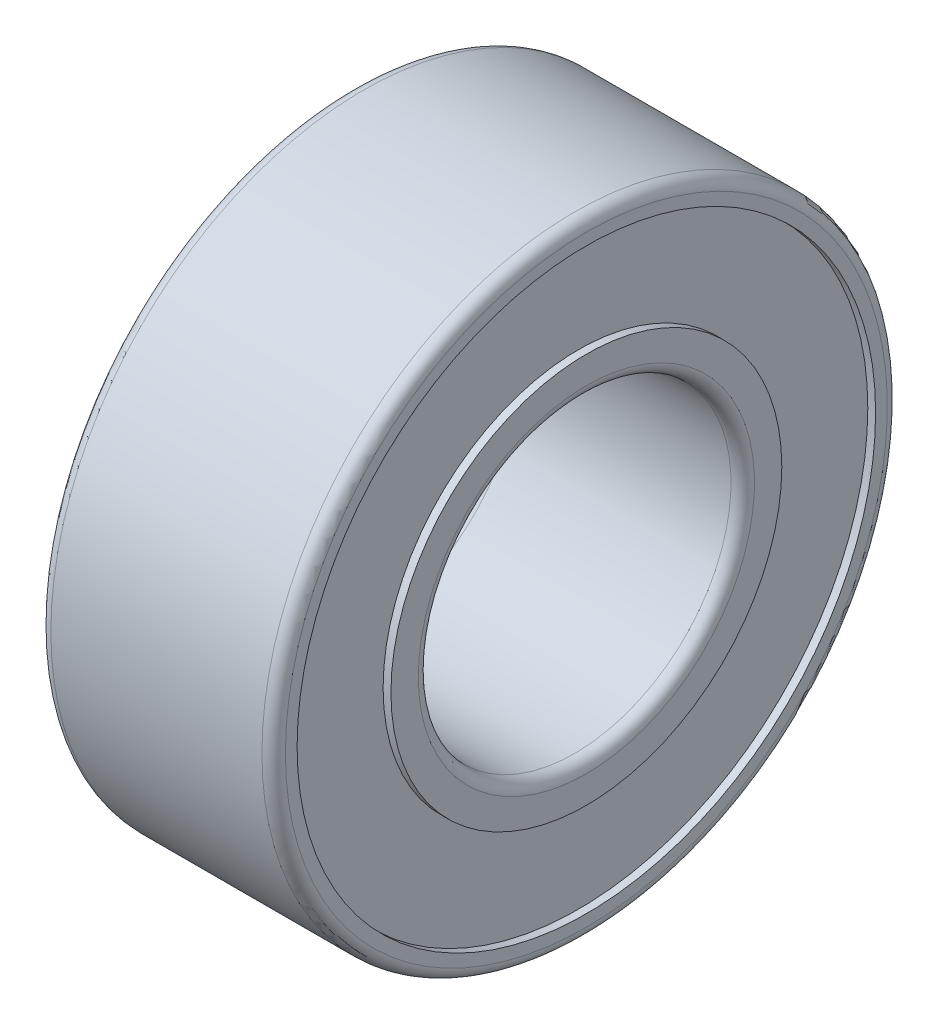
ISO-10303-21;
HEADER;
FILE_DESCRIPTION(('STEP AP214'),'2;1');
FILE_NAME('part.step','',(''),(''),'','','');
FILE_SCHEMA(('AUTOMOTIVE_DESIGN { 1 0 10303 214 1 1 1 1 }'));
ENDSEC;
DATA;
#1=APPLICATION_CONTEXT('core data for automotive mechanical design processes');
#2=APPLICATION_PROTOCOL_DEFINITION('international standard','automotive_design',2000,#1);
#3=PRODUCT_CONTEXT('',#1,'mechanical');
#4=PRODUCT('Part','Part','',(#3));
#5=PRODUCT_RELATED_PRODUCT_CATEGORY('part','',(#4));
#6=PRODUCT_DEFINITION_FORMATION('','',#4);
#7=PRODUCT_DEFINITION_CONTEXT('part definition',#1,'design');
#8=PRODUCT_DEFINITION('design','',#6,#7);
#9=PRODUCT_DEFINITION_SHAPE('','',#8);
#10=(LENGTH_UNIT() NAMED_UNIT(*) SI_UNIT(.MILLI.,.METRE.));
#11=(NAMED_UNIT(*) PLANE_ANGLE_UNIT() SI_UNIT($,.RADIAN.));
#12=(NAMED_UNIT(*) SI_UNIT($,.STERADIAN.) SOLID_ANGLE_UNIT());
#13=UNCERTAINTY_MEASURE_WITH_UNIT(LENGTH_MEASURE(1.E-05),#10,'distance_accuracy_value','');
#14=(GEOMETRIC_REPRESENTATION_CONTEXT(3) GLOBAL_UNCERTAINTY_ASSIGNED_CONTEXT((#13)) GLOBAL_UNIT_ASSIGNED_CONTEXT((#10,
#11,#12)) REPRESENTATION_CONTEXT('',''));
#15=CARTESIAN_POINT('',(0.,0.,0.));
#16=DIRECTION('',(0.,0.,1.));
#17=DIRECTION('',(1.,0.,0.));
#18=AXIS2_PLACEMENT_3D('',#15,#16,#17);
#19=CARTESIAN_POINT('',(-1.35,0.,0.));
#20=DIRECTION('',(1.,0.,0.));
#21=DIRECTION('',(0.,0.,1.));
#22=AXIS2_PLACEMENT_3D('',#19,#20,#21);
#23=TOROIDAL_SURFACE('',#22,2.15,0.15);
#24=CARTESIAN_POINT('',(-1.5,0.,0.));
#25=DIRECTION('',(-1.,0.,0.));
#26=DIRECTION('',(0.,0.,1.));
#27=AXIS2_PLACEMENT_3D('',#24,#25,#26);
#28=CIRCLE('',#27,2.15);
#29=CARTESIAN_POINT('',(-1.5,0.,2.15));
#30=VERTEX_POINT('',#29);
#31=EDGE_CURVE('E43',#30,#30,#28,.T.);
#32=ORIENTED_EDGE('',*,*,#31,.T.);
#33=EDGE_LOOP('',(#32));
#34=FACE_BOUND('',#33,.T.);
#35=CARTESIAN_POINT('',(-1.35,0.,0.));
#36=DIRECTION('',(1.,0.,0.));
#37=DIRECTION('',(0.,0.,1.));
#38=AXIS2_PLACEMENT_3D('',#35,#36,#37);
#39=CIRCLE('',#38,2.);
#40=CARTESIAN_POINT('',(-1.35,0.,2.));
#41=VERTEX_POINT('',#40);
#42=EDGE_CURVE('E79',#41,#41,#39,.T.);
#43=ORIENTED_EDGE('',*,*,#42,.T.);
#44=EDGE_LOOP('',(#43));
#45=FACE_BOUND('',#44,.T.);
#46=ADVANCED_FACE('F15',(#34,#45),#23,.T.);
#47=CARTESIAN_POINT('',(-1.35,0.,0.));
#48=DIRECTION('',(1.,0.,0.));
#49=DIRECTION('',(0.,0.,1.));
#50=AXIS2_PLACEMENT_3D('',#47,#48,#49);
#51=TOROIDAL_SURFACE('',#50,3.85,0.15);
#52=CARTESIAN_POINT('',(-1.35,0.,0.));
#53=DIRECTION('',(-1.,0.,0.));
#54=DIRECTION('',(0.,0.,1.));
#55=AXIS2_PLACEMENT_3D('',#52,#53,#54);
#56=CIRCLE('',#55,4.);
#57=CARTESIAN_POINT('',(-1.35,0.,4.));
#58=VERTEX_POINT('',#57);
#59=EDGE_CURVE('E47',#58,#58,#56,.T.);
#60=ORIENTED_EDGE('',*,*,#59,.T.);
#61=EDGE_LOOP('',(#60));
#62=FACE_BOUND('',#61,.T.);
#63=CARTESIAN_POINT('',(-1.5,0.,0.));
#64=DIRECTION('',(1.,0.,0.));
#65=DIRECTION('',(0.,0.,1.));
#66=AXIS2_PLACEMENT_3D('',#63,#64,#65);
#67=CIRCLE('',#66,3.85);
#68=CARTESIAN_POINT('',(-1.5,0.,3.85));
#69=VERTEX_POINT('',#68);
#70=EDGE_CURVE('E10',#69,#69,#67,.T.);
#71=ORIENTED_EDGE('',*,*,#70,.T.);
#72=EDGE_LOOP('',(#71));
#73=FACE_BOUND('',#72,.T.);
#74=ADVANCED_FACE('F17',(#62,#73),#51,.T.);
#75=CARTESIAN_POINT('',(-1.5,0.,3.85));
#76=DIRECTION('',(1.,0.,0.));
#77=DIRECTION('',(0.,1.,0.));
#78=AXIS2_PLACEMENT_3D('',#75,#76,#77);
#79=PLANE('',#78);
#80=CARTESIAN_POINT('',(-1.5,0.,0.));
#81=DIRECTION('',(-1.,0.,0.));
#82=DIRECTION('',(0.,0.,1.));
#83=AXIS2_PLACEMENT_3D('',#80,#81,#82);
#84=CIRCLE('',#83,3.7);
#85=CARTESIAN_POINT('',(-1.5,0.,3.7));
#86=VERTEX_POINT('',#85);
#87=EDGE_CURVE('E23',#86,#86,#84,.T.);
#88=ORIENTED_EDGE('',*,*,#87,.F.);
#89=EDGE_LOOP('',(#88));
#90=FACE_BOUND('',#89,.T.);
#91=ORIENTED_EDGE('',*,*,#70,.F.);
#92=EDGE_LOOP('',(#91));
#93=FACE_BOUND('',#92,.T.);
#94=ADVANCED_FACE('F118',(#90,#93),#79,.F.);
#95=CARTESIAN_POINT('',(-0.75,0.,0.));
#96=DIRECTION('',(1.,0.,0.));
#97=DIRECTION('',(0.,0.,1.));
#98=AXIS2_PLACEMENT_3D('',#95,#96,#97);
#99=CYLINDRICAL_SURFACE('',#98,3.7);
#100=CARTESIAN_POINT('',(-1.4,0.,0.));
#101=DIRECTION('',(-1.,0.,0.));
#102=DIRECTION('',(0.,0.,1.));
#103=AXIS2_PLACEMENT_3D('',#100,#101,#102);
#104=CIRCLE('',#103,3.7);
#105=CARTESIAN_POINT('',(-1.4,0.,3.7));
#106=VERTEX_POINT('',#105);
#107=EDGE_CURVE('E30',#106,#106,#104,.T.);
#108=ORIENTED_EDGE('',*,*,#107,.F.);
#109=EDGE_LOOP('',(#108));
#110=FACE_BOUND('',#109,.T.);
#111=ORIENTED_EDGE('',*,*,#87,.T.);
#112=EDGE_LOOP('',(#111));
#113=FACE_BOUND('',#112,.T.);
#114=ADVANCED_FACE('F124',(#110,#113),#99,.F.);
#115=CARTESIAN_POINT('',(-1.4,0.,3.1));
#116=DIRECTION('',(1.,0.,0.));
#117=DIRECTION('',(0.,1.,0.));
#118=AXIS2_PLACEMENT_3D('',#115,#116,#117);
#119=PLANE('',#118);
#120=CARTESIAN_POINT('',(-1.4,0.,0.));
#121=DIRECTION('',(-1.,0.,0.));
#122=DIRECTION('',(0.,0.,1.));
#123=AXIS2_PLACEMENT_3D('',#120,#121,#122);
#124=CIRCLE('',#123,2.5);
#125=CARTESIAN_POINT('',(-1.4,0.,2.5));
#126=VERTEX_POINT('',#125);
#127=EDGE_CURVE('E36',#126,#126,#124,.T.);
#128=ORIENTED_EDGE('',*,*,#127,.F.);
#129=EDGE_LOOP('',(#128));
#130=FACE_BOUND('',#129,.T.);
#131=ORIENTED_EDGE('',*,*,#107,.T.);
#132=EDGE_LOOP('',(#131));
#133=FACE_BOUND('',#132,.T.);
#134=ADVANCED_FACE('F127',(#130,#133),#119,.F.);
#135=CARTESIAN_POINT('',(-0.75,0.,0.));
#136=DIRECTION('',(1.,0.,0.));
#137=DIRECTION('',(0.,0.,1.));
#138=AXIS2_PLACEMENT_3D('',#135,#136,#137);
#139=CYLINDRICAL_SURFACE('',#138,2.5);
#140=CARTESIAN_POINT('',(-1.5,0.,0.));
#141=DIRECTION('',(-1.,0.,0.));
#142=DIRECTION('',(0.,0.,1.));
#143=AXIS2_PLACEMENT_3D('',#140,#141,#142);
#144=CIRCLE('',#143,2.5);
#145=CARTESIAN_POINT('',(-1.5,0.,2.5));
#146=VERTEX_POINT('',#145);
#147=EDGE_CURVE('E39',#146,#146,#144,.T.);
#148=ORIENTED_EDGE('',*,*,#147,.F.);
#149=EDGE_LOOP('',(#148));
#150=FACE_BOUND('',#149,.T.);
#151=ORIENTED_EDGE('',*,*,#127,.T.);
#152=EDGE_LOOP('',(#151));
#153=FACE_BOUND('',#152,.T.);
#154=ADVANCED_FACE('F143',(#150,#153),#139,.T.);
#155=CARTESIAN_POINT('',(-1.5,0.,2.25));
#156=DIRECTION('',(1.,0.,0.));
#157=DIRECTION('',(0.,1.,0.));
#158=AXIS2_PLACEMENT_3D('',#155,#156,#157);
#159=PLANE('',#158);
#160=ORIENTED_EDGE('',*,*,#147,.T.);
#161=EDGE_LOOP('',(#160));
#162=FACE_BOUND('',#161,.T.);
#163=ORIENTED_EDGE('',*,*,#31,.F.);
#164=EDGE_LOOP('',(#163));
#165=FACE_BOUND('',#164,.T.);
#166=ADVANCED_FACE('F107',(#162,#165),#159,.F.);
#167=CARTESIAN_POINT('',(1.35,0.,0.));
#168=DIRECTION('',(-1.,0.,0.));
#169=DIRECTION('',(0.,0.,1.));
#170=AXIS2_PLACEMENT_3D('',#167,#168,#169);
#171=TOROIDAL_SURFACE('',#170,2.15,0.15);
#172=CARTESIAN_POINT('',(1.5,0.,0.));
#173=DIRECTION('',(-1.,0.,0.));
#174=DIRECTION('',(0.,0.,1.));
#175=AXIS2_PLACEMENT_3D('',#172,#173,#174);
#176=CIRCLE('',#175,2.15);
#177=CARTESIAN_POINT('',(1.5,0.,2.15));
#178=VERTEX_POINT('',#177);
#179=EDGE_CURVE('E75',#178,#178,#176,.T.);
#180=ORIENTED_EDGE('',*,*,#179,.F.);
#181=EDGE_LOOP('',(#180));
#182=FACE_BOUND('',#181,.T.);
#183=CARTESIAN_POINT('',(1.35,0.,0.));
#184=DIRECTION('',(1.,0.,0.));
#185=DIRECTION('',(0.,0.,1.));
#186=AXIS2_PLACEMENT_3D('',#183,#184,#185);
#187=CIRCLE('',#186,2.);
#188=CARTESIAN_POINT('',(1.35,0.,2.));
#189=VERTEX_POINT('',#188);
#190=EDGE_CURVE('E83',#189,#189,#187,.T.);
#191=ORIENTED_EDGE('',*,*,#190,.F.);
#192=EDGE_LOOP('',(#191));
#193=FACE_BOUND('',#192,.T.);
#194=ADVANCED_FACE('F97',(#182,#193),#171,.T.);
#195=CARTESIAN_POINT('',(1.35,0.,0.));
#196=DIRECTION('',(-1.,0.,0.));
#197=DIRECTION('',(0.,0.,1.));
#198=AXIS2_PLACEMENT_3D('',#195,#196,#197);
#199=TOROIDAL_SURFACE('',#198,3.85,0.15);
#200=CARTESIAN_POINT('',(1.35,0.,0.));
#201=DIRECTION('',(-1.,0.,0.));
#202=DIRECTION('',(0.,0.,1.));
#203=AXIS2_PLACEMENT_3D('',#200,#201,#202);
#204=CIRCLE('',#203,4.);
#205=CARTESIAN_POINT('',(1.35,0.,4.));
#206=VERTEX_POINT('',#205);
#207=EDGE_CURVE('E51',#206,#206,#204,.T.);
#208=ORIENTED_EDGE('',*,*,#207,.F.);
#209=EDGE_LOOP('',(#208));
#210=FACE_BOUND('',#209,.T.);
#211=CARTESIAN_POINT('',(1.5,0.,0.));
#212=DIRECTION('',(1.,0.,0.));
#213=DIRECTION('',(0.,0.,1.));
#214=AXIS2_PLACEMENT_3D('',#211,#212,#213);
#215=CIRCLE('',#214,3.85);
#216=CARTESIAN_POINT('',(1.5,0.,3.85));
#217=VERTEX_POINT('',#216);
#218=EDGE_CURVE('E55',#217,#217,#215,.T.);
#219=ORIENTED_EDGE('',*,*,#218,.F.);
#220=EDGE_LOOP('',(#219));
#221=FACE_BOUND('',#220,.T.);
#222=ADVANCED_FACE('F94',(#210,#221),#199,.T.);
#223=CARTESIAN_POINT('',(0.75,0.,0.));
#224=DIRECTION('',(-1.,0.,0.));
#225=DIRECTION('',(0.,0.,1.));
#226=AXIS2_PLACEMENT_3D('',#223,#224,#225);
#227=CYLINDRICAL_SURFACE('',#226,4.);
#228=ORIENTED_EDGE('',*,*,#59,.F.);
#229=EDGE_LOOP('',(#228));
#230=FACE_BOUND('',#229,.T.);
#231=ORIENTED_EDGE('',*,*,#207,.T.);
#232=EDGE_LOOP('',(#231));
#233=FACE_BOUND('',#232,.T.);
#234=ADVANCED_FACE('F96',(#230,#233),#227,.T.);
#235=CARTESIAN_POINT('',(1.5,0.,3.85));
#236=DIRECTION('',(-1.,0.,0.));
#237=DIRECTION('',(0.,0.,1.));
#238=AXIS2_PLACEMENT_3D('',#235,#236,#237);
#239=PLANE('',#238);
#240=CARTESIAN_POINT('',(1.5,0.,0.));
#241=DIRECTION('',(-1.,0.,0.));
#242=DIRECTION('',(0.,0.,1.));
#243=AXIS2_PLACEMENT_3D('',#240,#241,#242);
#244=CIRCLE('',#243,3.7);
#245=CARTESIAN_POINT('',(1.5,0.,3.7));
#246=VERTEX_POINT('',#245);
#247=EDGE_CURVE('E60',#246,#246,#244,.T.);
#248=ORIENTED_EDGE('',*,*,#247,.T.);
#249=EDGE_LOOP('',(#248));
#250=FACE_BOUND('',#249,.T.);
#251=ORIENTED_EDGE('',*,*,#218,.T.);
#252=EDGE_LOOP('',(#251));
#253=FACE_BOUND('',#252,.T.);
#254=ADVANCED_FACE('F92',(#250,#253),#239,.F.);
#255=CARTESIAN_POINT('',(0.75,0.,0.));
#256=DIRECTION('',(-1.,0.,0.));
#257=DIRECTION('',(0.,0.,1.));
#258=AXIS2_PLACEMENT_3D('',#255,#256,#257);
#259=CYLINDRICAL_SURFACE('',#258,3.7);
#260=CARTESIAN_POINT('',(1.4,0.,0.));
#261=DIRECTION('',(-1.,0.,0.));
#262=DIRECTION('',(0.,0.,1.));
#263=AXIS2_PLACEMENT_3D('',#260,#261,#262);
#264=CIRCLE('',#263,3.7);
#265=CARTESIAN_POINT('',(1.4,0.,3.7));
#266=VERTEX_POINT('',#265);
#267=EDGE_CURVE('E56',#266,#266,#264,.T.);
#268=ORIENTED_EDGE('',*,*,#267,.T.);
#269=EDGE_LOOP('',(#268));
#270=FACE_BOUND('',#269,.T.);
#271=ORIENTED_EDGE('',*,*,#247,.F.);
#272=EDGE_LOOP('',(#271));
#273=FACE_BOUND('',#272,.T.);
#274=ADVANCED_FACE('F137',(#270,#273),#259,.F.);
#275=CARTESIAN_POINT('',(1.4,0.,3.1));
#276=DIRECTION('',(-1.,0.,0.));
#277=DIRECTION('',(0.,0.,1.));
#278=AXIS2_PLACEMENT_3D('',#275,#276,#277);
#279=PLANE('',#278);
#280=CARTESIAN_POINT('',(1.4,0.,0.));
#281=DIRECTION('',(-1.,0.,0.));
#282=DIRECTION('',(0.,0.,1.));
#283=AXIS2_PLACEMENT_3D('',#280,#281,#282);
#284=CIRCLE('',#283,2.5);
#285=CARTESIAN_POINT('',(1.4,0.,2.5));
#286=VERTEX_POINT('',#285);
#287=EDGE_CURVE('E61',#286,#286,#284,.T.);
#288=ORIENTED_EDGE('',*,*,#287,.T.);
#289=EDGE_LOOP('',(#288));
#290=FACE_BOUND('',#289,.T.);
#291=ORIENTED_EDGE('',*,*,#267,.F.);
#292=EDGE_LOOP('',(#291));
#293=FACE_BOUND('',#292,.T.);
#294=ADVANCED_FACE('F134',(#290,#293),#279,.F.);
#295=CARTESIAN_POINT('',(0.75,0.,0.));
#296=DIRECTION('',(-1.,0.,0.));
#297=DIRECTION('',(0.,0.,1.));
#298=AXIS2_PLACEMENT_3D('',#295,#296,#297);
#299=CYLINDRICAL_SURFACE('',#298,2.5);
#300=CARTESIAN_POINT('',(1.5,0.,0.));
#301=DIRECTION('',(-1.,0.,0.));
#302=DIRECTION('',(0.,0.,1.));
#303=AXIS2_PLACEMENT_3D('',#300,#301,#302);
#304=CIRCLE('',#303,2.5);
#305=CARTESIAN_POINT('',(1.5,0.,2.5));
#306=VERTEX_POINT('',#305);
#307=EDGE_CURVE('E65',#306,#306,#304,.T.);
#308=ORIENTED_EDGE('',*,*,#307,.T.);
#309=EDGE_LOOP('',(#308));
#310=FACE_BOUND('',#309,.T.);
#311=ORIENTED_EDGE('',*,*,#287,.F.);
#312=EDGE_LOOP('',(#311));
#313=FACE_BOUND('',#312,.T.);
#314=ADVANCED_FACE('F132',(#310,#313),#299,.T.);
#315=CARTESIAN_POINT('',(1.5,0.,2.25));
#316=DIRECTION('',(-1.,0.,0.));
#317=DIRECTION('',(0.,0.,1.));
#318=AXIS2_PLACEMENT_3D('',#315,#316,#317);
#319=PLANE('',#318);
#320=ORIENTED_EDGE('',*,*,#307,.F.);
#321=EDGE_LOOP('',(#320));
#322=FACE_BOUND('',#321,.T.);
#323=ORIENTED_EDGE('',*,*,#179,.T.);
#324=EDGE_LOOP('',(#323));
#325=FACE_BOUND('',#324,.T.);
#326=ADVANCED_FACE('F129',(#322,#325),#319,.F.);
#327=CARTESIAN_POINT('',(0.75,0.,0.));
#328=DIRECTION('',(-1.,0.,0.));
#329=DIRECTION('',(0.,0.,1.));
#330=AXIS2_PLACEMENT_3D('',#327,#328,#329);
#331=CYLINDRICAL_SURFACE('',#330,2.);
#332=ORIENTED_EDGE('',*,*,#42,.F.);
#333=EDGE_LOOP('',(#332));
#334=FACE_BOUND('',#333,.T.);
#335=ORIENTED_EDGE('',*,*,#190,.T.);
#336=EDGE_LOOP('',(#335));
#337=FACE_BOUND('',#336,.T.);
#338=ADVANCED_FACE('F123',(#334,#337),#331,.F.);
#339=CLOSED_SHELL('',(#46,#74,#94,#114,#134,#154,#166,#194,#222,#234,#254,#274,#294,#314,#326,#338));
#340=MANIFOLD_SOLID_BREP('B1',#339);
#341=ADVANCED_BREP_SHAPE_REPRESENTATION('',(#18,#340),#14);
#342=SHAPE_DEFINITION_REPRESENTATION(#9,#341);
ENDSEC;
END-ISO-10303-21;
